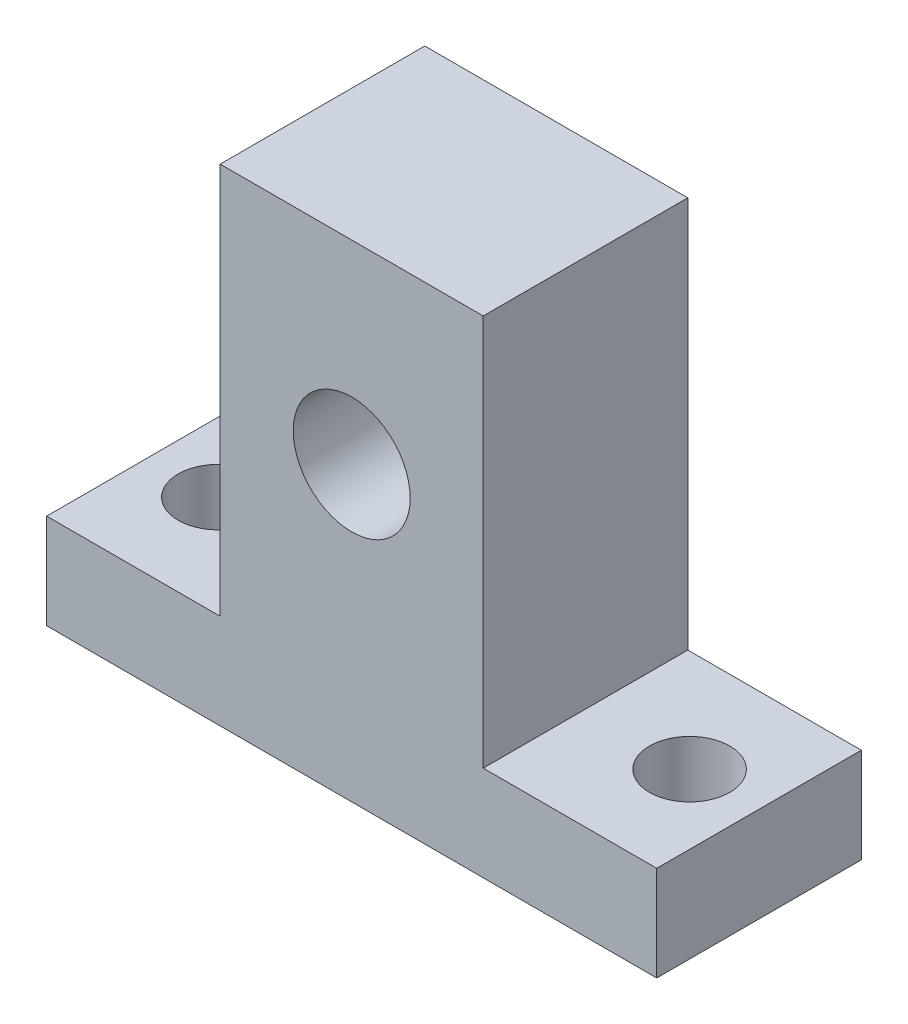
ISO-10303-21;
HEADER;
FILE_DESCRIPTION(('STEP AP214'),'2;1');
FILE_NAME('part.step','',(''),(''),'','','');
FILE_SCHEMA(('AUTOMOTIVE_DESIGN { 1 0 10303 214 1 1 1 1 }'));
ENDSEC;
DATA;
#1=APPLICATION_CONTEXT('core data for automotive mechanical design processes');
#2=APPLICATION_PROTOCOL_DEFINITION('international standard','automotive_design',2000,#1);
#3=PRODUCT_CONTEXT('',#1,'mechanical');
#4=PRODUCT('Part','Part','',(#3));
#5=PRODUCT_RELATED_PRODUCT_CATEGORY('part','',(#4));
#6=PRODUCT_DEFINITION_FORMATION('','',#4);
#7=PRODUCT_DEFINITION_CONTEXT('part definition',#1,'design');
#8=PRODUCT_DEFINITION('design','',#6,#7);
#9=PRODUCT_DEFINITION_SHAPE('','',#8);
#10=(LENGTH_UNIT() NAMED_UNIT(*) SI_UNIT(.MILLI.,.METRE.));
#11=(NAMED_UNIT(*) PLANE_ANGLE_UNIT() SI_UNIT($,.RADIAN.));
#12=(NAMED_UNIT(*) SI_UNIT($,.STERADIAN.) SOLID_ANGLE_UNIT());
#13=UNCERTAINTY_MEASURE_WITH_UNIT(LENGTH_MEASURE(1.E-05),#10,'distance_accuracy_value','');
#14=(GEOMETRIC_REPRESENTATION_CONTEXT(3) GLOBAL_UNCERTAINTY_ASSIGNED_CONTEXT((#13)) GLOBAL_UNIT_ASSIGNED_CONTEXT((#10,
#11,#12)) REPRESENTATION_CONTEXT('',''));
#15=CARTESIAN_POINT('',(0.,0.,0.));
#16=DIRECTION('',(0.,0.,1.));
#17=DIRECTION('',(1.,0.,0.));
#18=AXIS2_PLACEMENT_3D('',#15,#16,#17);
#19=CARTESIAN_POINT('',(0.,6.5,0.));
#20=DIRECTION('',(0.,-1.,0.));
#21=DIRECTION('',(0.,0.,-1.));
#22=AXIS2_PLACEMENT_3D('',#19,#20,#21);
#23=PLANE('',#22);
#24=CARTESIAN_POINT('',(4.75000000000001,6.5,-7.));
#25=DIRECTION('',(0.,1.,0.));
#26=DIRECTION('',(0.,0.,-1.));
#27=AXIS2_PLACEMENT_3D('',#24,#25,#26);
#28=CIRCLE('',#27,2.75);
#29=CARTESIAN_POINT('',(4.75000000000001,6.5,-4.25));
#30=VERTEX_POINT('',#29);
#31=EDGE_CURVE('E183',#30,#30,#28,.T.);
#32=ORIENTED_EDGE('',*,*,#31,.F.);
#33=EDGE_LOOP('',(#32));
#34=FACE_BOUND('',#33,.T.);
#35=DIRECTION('',(0.,0.,1.));
#36=VECTOR('',#35,1.);
#37=CARTESIAN_POINT('',(11.875,6.5,0.));
#38=LINE('',#37,#36);
#39=CARTESIAN_POINT('',(11.875,6.5,-14.));
#40=VERTEX_POINT('',#39);
#41=CARTESIAN_POINT('',(11.875,6.5,0.));
#42=VERTEX_POINT('',#41);
#43=EDGE_CURVE('E49',#40,#42,#38,.T.);
#44=ORIENTED_EDGE('',*,*,#43,.F.);
#45=DIRECTION('',(-1.,0.,0.));
#46=VECTOR('',#45,1.);
#47=CARTESIAN_POINT('',(0.,6.5,-14.));
#48=LINE('',#47,#46);
#49=CARTESIAN_POINT('',(0.,6.5,-14.));
#50=VERTEX_POINT('',#49);
#51=EDGE_CURVE('E138',#40,#50,#48,.T.);
#52=ORIENTED_EDGE('',*,*,#51,.T.);
#53=DIRECTION('',(0.,0.,1.));
#54=VECTOR('',#53,1.);
#55=CARTESIAN_POINT('',(0.,6.5,0.));
#56=LINE('',#55,#54);
#57=CARTESIAN_POINT('',(0.,6.5,0.));
#58=VERTEX_POINT('',#57);
#59=EDGE_CURVE('E129',#50,#58,#56,.T.);
#60=ORIENTED_EDGE('',*,*,#59,.T.);
#61=DIRECTION('',(1.,0.,0.));
#62=VECTOR('',#61,1.);
#63=CARTESIAN_POINT('',(0.,6.5,0.));
#64=LINE('',#63,#62);
#65=EDGE_CURVE('E134',#58,#42,#64,.T.);
#66=ORIENTED_EDGE('',*,*,#65,.T.);
#67=EDGE_LOOP('',(#44,#52,#60,#66));
#68=FACE_BOUND('',#67,.T.);
#69=ADVANCED_FACE('F34',(#34,#68),#23,.F.);
#70=CARTESIAN_POINT('',(37.,6.5,-7.));
#71=DIRECTION('',(0.,1.,0.));
#72=DIRECTION('',(0.,0.,1.));
#73=AXIS2_PLACEMENT_3D('',#70,#71,#72);
#74=CIRCLE('',#73,2.75);
#75=CARTESIAN_POINT('',(37.,6.5,-4.25));
#76=VERTEX_POINT('',#75);
#77=EDGE_CURVE('E189',#76,#76,#74,.T.);
#78=ORIENTED_EDGE('',*,*,#77,.F.);
#79=EDGE_LOOP('',(#78));
#80=FACE_BOUND('',#79,.T.);
#81=DIRECTION('',(0.,0.,-1.));
#82=VECTOR('',#81,1.);
#83=CARTESIAN_POINT('',(29.875,6.5,0.));
#84=LINE('',#83,#82);
#85=CARTESIAN_POINT('',(29.875,6.5,0.));
#86=VERTEX_POINT('',#85);
#87=CARTESIAN_POINT('',(29.875,6.5,-14.));
#88=VERTEX_POINT('',#87);
#89=EDGE_CURVE('E57',#86,#88,#84,.T.);
#90=ORIENTED_EDGE('',*,*,#89,.F.);
#91=CARTESIAN_POINT('',(41.75,6.5,0.));
#92=VERTEX_POINT('',#91);
#93=EDGE_CURVE('E132',#86,#92,#64,.T.);
#94=ORIENTED_EDGE('',*,*,#93,.T.);
#95=DIRECTION('',(0.,0.,-1.));
#96=VECTOR('',#95,1.);
#97=CARTESIAN_POINT('',(41.75,6.5,0.));
#98=LINE('',#97,#96);
#99=CARTESIAN_POINT('',(41.75,6.5,-14.));
#100=VERTEX_POINT('',#99);
#101=EDGE_CURVE('E136',#92,#100,#98,.T.);
#102=ORIENTED_EDGE('',*,*,#101,.T.);
#103=EDGE_CURVE('E139',#100,#88,#48,.T.);
#104=ORIENTED_EDGE('',*,*,#103,.T.);
#105=EDGE_LOOP('',(#90,#94,#102,#104));
#106=FACE_BOUND('',#105,.T.);
#107=ADVANCED_FACE('F204',(#80,#106),#23,.F.);
#108=CARTESIAN_POINT('',(0.,6.5,0.));
#109=DIRECTION('',(1.,0.,0.));
#110=DIRECTION('',(0.,0.,-1.));
#111=AXIS2_PLACEMENT_3D('',#108,#109,#110);
#112=PLANE('',#111);
#113=DIRECTION('',(0.,0.,1.));
#114=VECTOR('',#113,1.);
#115=CARTESIAN_POINT('',(0.,0.,0.));
#116=LINE('',#115,#114);
#117=CARTESIAN_POINT('',(0.,0.,-14.));
#118=VERTEX_POINT('',#117);
#119=CARTESIAN_POINT('',(0.,0.,0.));
#120=VERTEX_POINT('',#119);
#121=EDGE_CURVE('E120',#118,#120,#116,.T.);
#122=ORIENTED_EDGE('',*,*,#121,.T.);
#123=DIRECTION('',(0.,-1.,0.));
#124=VECTOR('',#123,1.);
#125=CARTESIAN_POINT('',(0.,6.5,0.));
#126=LINE('',#125,#124);
#127=EDGE_CURVE('E11',#58,#120,#126,.T.);
#128=ORIENTED_EDGE('',*,*,#127,.F.);
#129=ORIENTED_EDGE('',*,*,#59,.F.);
#130=DIRECTION('',(0.,-1.,0.));
#131=VECTOR('',#130,1.);
#132=CARTESIAN_POINT('',(0.,6.5,-14.));
#133=LINE('',#132,#131);
#134=EDGE_CURVE('E140',#50,#118,#133,.T.);
#135=ORIENTED_EDGE('',*,*,#134,.T.);
#136=EDGE_LOOP('',(#122,#128,#129,#135));
#137=FACE_BOUND('',#136,.T.);
#138=ADVANCED_FACE('F36',(#137),#112,.F.);
#139=CARTESIAN_POINT('',(0.,6.5,0.));
#140=DIRECTION('',(0.,0.,-1.));
#141=DIRECTION('',(-1.,0.,0.));
#142=AXIS2_PLACEMENT_3D('',#139,#140,#141);
#143=PLANE('',#142);
#144=CARTESIAN_POINT('',(20.875,20.,0.));
#145=DIRECTION('',(0.,0.,-1.));
#146=DIRECTION('',(-1.,0.,0.));
#147=AXIS2_PLACEMENT_3D('',#144,#145,#146);
#148=CIRCLE('',#147,4.);
#149=CARTESIAN_POINT('',(16.875,20.,0.));
#150=VERTEX_POINT('',#149);
#151=EDGE_CURVE('E174',#150,#150,#148,.T.);
#152=ORIENTED_EDGE('',*,*,#151,.T.);
#153=EDGE_LOOP('',(#152));
#154=FACE_BOUND('',#153,.T.);
#155=DIRECTION('',(1.,0.,0.));
#156=VECTOR('',#155,1.);
#157=CARTESIAN_POINT('',(0.,0.,0.));
#158=LINE('',#157,#156);
#159=CARTESIAN_POINT('',(41.75,0.,0.));
#160=VERTEX_POINT('',#159);
#161=EDGE_CURVE('E123',#120,#160,#158,.T.);
#162=ORIENTED_EDGE('',*,*,#161,.T.);
#163=DIRECTION('',(0.,-1.,0.));
#164=VECTOR('',#163,1.);
#165=CARTESIAN_POINT('',(41.75,6.5,0.));
#166=LINE('',#165,#164);
#167=EDGE_CURVE('E42',#92,#160,#166,.T.);
#168=ORIENTED_EDGE('',*,*,#167,.F.);
#169=ORIENTED_EDGE('',*,*,#93,.F.);
#170=DIRECTION('',(0.,-1.,0.));
#171=VECTOR('',#170,1.);
#172=CARTESIAN_POINT('',(29.875,33.3,0.));
#173=LINE('',#172,#171);
#174=CARTESIAN_POINT('',(29.875,33.3,0.));
#175=VERTEX_POINT('',#174);
#176=EDGE_CURVE('E105',#175,#86,#173,.T.);
#177=ORIENTED_EDGE('',*,*,#176,.F.);
#178=DIRECTION('',(1.,0.,0.));
#179=VECTOR('',#178,1.);
#180=CARTESIAN_POINT('',(11.875,33.3,0.));
#181=LINE('',#180,#179);
#182=CARTESIAN_POINT('',(11.875,33.3,0.));
#183=VERTEX_POINT('',#182);
#184=EDGE_CURVE('E99',#183,#175,#181,.T.);
#185=ORIENTED_EDGE('',*,*,#184,.F.);
#186=DIRECTION('',(0.,-1.,0.));
#187=VECTOR('',#186,1.);
#188=CARTESIAN_POINT('',(11.875,33.3,0.));
#189=LINE('',#188,#187);
#190=EDGE_CURVE('E103',#183,#42,#189,.T.);
#191=ORIENTED_EDGE('',*,*,#190,.T.);
#192=ORIENTED_EDGE('',*,*,#65,.F.);
#193=ORIENTED_EDGE('',*,*,#127,.T.);
#194=EDGE_LOOP('',(#162,#168,#169,#177,#185,#191,#192,#193));
#195=FACE_BOUND('',#194,.T.);
#196=ADVANCED_FACE('F101',(#154,#195),#143,.F.);
#197=CARTESIAN_POINT('',(41.75,6.5,0.));
#198=DIRECTION('',(-1.,0.,0.));
#199=DIRECTION('',(0.,0.,1.));
#200=AXIS2_PLACEMENT_3D('',#197,#198,#199);
#201=PLANE('',#200);
#202=DIRECTION('',(0.,0.,-1.));
#203=VECTOR('',#202,1.);
#204=CARTESIAN_POINT('',(41.75,0.,0.));
#205=LINE('',#204,#203);
#206=CARTESIAN_POINT('',(41.75,0.,-14.));
#207=VERTEX_POINT('',#206);
#208=EDGE_CURVE('E143',#160,#207,#205,.T.);
#209=ORIENTED_EDGE('',*,*,#208,.T.);
#210=DIRECTION('',(0.,-1.,0.));
#211=VECTOR('',#210,1.);
#212=CARTESIAN_POINT('',(41.75,6.5,-14.));
#213=LINE('',#212,#211);
#214=EDGE_CURVE('E148',#100,#207,#213,.T.);
#215=ORIENTED_EDGE('',*,*,#214,.F.);
#216=ORIENTED_EDGE('',*,*,#101,.F.);
#217=ORIENTED_EDGE('',*,*,#167,.T.);
#218=EDGE_LOOP('',(#209,#215,#216,#217));
#219=FACE_BOUND('',#218,.T.);
#220=ADVANCED_FACE('F155',(#219),#201,.F.);
#221=CARTESIAN_POINT('',(0.,6.5,-14.));
#222=DIRECTION('',(0.,0.,1.));
#223=DIRECTION('',(1.,0.,0.));
#224=AXIS2_PLACEMENT_3D('',#221,#222,#223);
#225=PLANE('',#224);
#226=CARTESIAN_POINT('',(20.875,20.,-14.));
#227=DIRECTION('',(0.,0.,1.));
#228=DIRECTION('',(1.,0.,0.));
#229=AXIS2_PLACEMENT_3D('',#226,#227,#228);
#230=CIRCLE('',#229,4.);
#231=CARTESIAN_POINT('',(24.875,20.,-14.));
#232=VERTEX_POINT('',#231);
#233=EDGE_CURVE('E179',#232,#232,#230,.T.);
#234=ORIENTED_EDGE('',*,*,#233,.T.);
#235=EDGE_LOOP('',(#234));
#236=FACE_BOUND('',#235,.T.);
#237=DIRECTION('',(-1.,0.,0.));
#238=VECTOR('',#237,1.);
#239=CARTESIAN_POINT('',(0.,0.,-14.));
#240=LINE('',#239,#238);
#241=EDGE_CURVE('E133',#207,#118,#240,.T.);
#242=ORIENTED_EDGE('',*,*,#241,.T.);
#243=ORIENTED_EDGE('',*,*,#134,.F.);
#244=ORIENTED_EDGE('',*,*,#51,.F.);
#245=DIRECTION('',(0.,-1.,0.));
#246=VECTOR('',#245,1.);
#247=CARTESIAN_POINT('',(11.875,33.3,-14.));
#248=LINE('',#247,#246);
#249=CARTESIAN_POINT('',(11.875,33.3,-14.));
#250=VERTEX_POINT('',#249);
#251=EDGE_CURVE('E168',#250,#40,#248,.T.);
#252=ORIENTED_EDGE('',*,*,#251,.F.);
#253=DIRECTION('',(-1.,0.,0.));
#254=VECTOR('',#253,1.);
#255=CARTESIAN_POINT('',(11.875,33.3,-14.));
#256=LINE('',#255,#254);
#257=CARTESIAN_POINT('',(29.875,33.3,-14.));
#258=VERTEX_POINT('',#257);
#259=EDGE_CURVE('E114',#258,#250,#256,.T.);
#260=ORIENTED_EDGE('',*,*,#259,.F.);
#261=DIRECTION('',(0.,-1.,0.));
#262=VECTOR('',#261,1.);
#263=CARTESIAN_POINT('',(29.875,33.3,-14.));
#264=LINE('',#263,#262);
#265=EDGE_CURVE('E125',#258,#88,#264,.T.);
#266=ORIENTED_EDGE('',*,*,#265,.T.);
#267=ORIENTED_EDGE('',*,*,#103,.F.);
#268=ORIENTED_EDGE('',*,*,#214,.T.);
#269=EDGE_LOOP('',(#242,#243,#244,#252,#260,#266,#267,#268));
#270=FACE_BOUND('',#269,.T.);
#271=ADVANCED_FACE('F163',(#236,#270),#225,.F.);
#272=CARTESIAN_POINT('',(0.,0.,0.));
#273=DIRECTION('',(0.,-1.,0.));
#274=DIRECTION('',(0.,0.,-1.));
#275=AXIS2_PLACEMENT_3D('',#272,#273,#274);
#276=PLANE('',#275);
#277=CARTESIAN_POINT('',(37.,0.,-7.));
#278=DIRECTION('',(0.,1.,0.));
#279=DIRECTION('',(0.,0.,1.));
#280=AXIS2_PLACEMENT_3D('',#277,#278,#279);
#281=CIRCLE('',#280,2.75);
#282=CARTESIAN_POINT('',(37.,0.,-4.25));
#283=VERTEX_POINT('',#282);
#284=EDGE_CURVE('E182',#283,#283,#281,.T.);
#285=ORIENTED_EDGE('',*,*,#284,.T.);
#286=EDGE_LOOP('',(#285));
#287=FACE_BOUND('',#286,.T.);
#288=CARTESIAN_POINT('',(4.75000000000001,0.,-7.));
#289=DIRECTION('',(0.,1.,0.));
#290=DIRECTION('',(0.,0.,-1.));
#291=AXIS2_PLACEMENT_3D('',#288,#289,#290);
#292=CIRCLE('',#291,2.75);
#293=CARTESIAN_POINT('',(4.75000000000001,0.,-4.25));
#294=VERTEX_POINT('',#293);
#295=EDGE_CURVE('E186',#294,#294,#292,.T.);
#296=ORIENTED_EDGE('',*,*,#295,.T.);
#297=EDGE_LOOP('',(#296));
#298=FACE_BOUND('',#297,.T.);
#299=ORIENTED_EDGE('',*,*,#121,.F.);
#300=ORIENTED_EDGE('',*,*,#241,.F.);
#301=ORIENTED_EDGE('',*,*,#208,.F.);
#302=ORIENTED_EDGE('',*,*,#161,.F.);
#303=EDGE_LOOP('',(#299,#300,#301,#302));
#304=FACE_BOUND('',#303,.T.);
#305=ADVANCED_FACE('F160',(#287,#298,#304),#276,.T.);
#306=CARTESIAN_POINT('',(11.875,33.3,0.));
#307=DIRECTION('',(1.,0.,0.));
#308=DIRECTION('',(0.,0.,-1.));
#309=AXIS2_PLACEMENT_3D('',#306,#307,#308);
#310=PLANE('',#309);
#311=ORIENTED_EDGE('',*,*,#43,.T.);
#312=ORIENTED_EDGE('',*,*,#190,.F.);
#313=DIRECTION('',(0.,0.,1.));
#314=VECTOR('',#313,1.);
#315=CARTESIAN_POINT('',(11.875,33.3,0.));
#316=LINE('',#315,#314);
#317=EDGE_CURVE('E109',#250,#183,#316,.T.);
#318=ORIENTED_EDGE('',*,*,#317,.F.);
#319=ORIENTED_EDGE('',*,*,#251,.T.);
#320=EDGE_LOOP('',(#311,#312,#318,#319));
#321=FACE_BOUND('',#320,.T.);
#322=ADVANCED_FACE('F119',(#321),#310,.F.);
#323=CARTESIAN_POINT('',(29.875,33.3,0.));
#324=DIRECTION('',(-1.,0.,0.));
#325=DIRECTION('',(0.,0.,1.));
#326=AXIS2_PLACEMENT_3D('',#323,#324,#325);
#327=PLANE('',#326);
#328=ORIENTED_EDGE('',*,*,#89,.T.);
#329=ORIENTED_EDGE('',*,*,#265,.F.);
#330=DIRECTION('',(0.,0.,-1.));
#331=VECTOR('',#330,1.);
#332=CARTESIAN_POINT('',(29.875,33.3,0.));
#333=LINE('',#332,#331);
#334=EDGE_CURVE('E108',#175,#258,#333,.T.);
#335=ORIENTED_EDGE('',*,*,#334,.F.);
#336=ORIENTED_EDGE('',*,*,#176,.T.);
#337=EDGE_LOOP('',(#328,#329,#335,#336));
#338=FACE_BOUND('',#337,.T.);
#339=ADVANCED_FACE('F237',(#338),#327,.F.);
#340=CARTESIAN_POINT('',(0.,33.3,0.));
#341=DIRECTION('',(0.,-1.,0.));
#342=DIRECTION('',(0.,0.,-1.));
#343=AXIS2_PLACEMENT_3D('',#340,#341,#342);
#344=PLANE('',#343);
#345=ORIENTED_EDGE('',*,*,#317,.T.);
#346=ORIENTED_EDGE('',*,*,#184,.T.);
#347=ORIENTED_EDGE('',*,*,#334,.T.);
#348=ORIENTED_EDGE('',*,*,#259,.T.);
#349=EDGE_LOOP('',(#345,#346,#347,#348));
#350=FACE_BOUND('',#349,.T.);
#351=ADVANCED_FACE('F112',(#350),#344,.F.);
#352=CARTESIAN_POINT('',(20.875,20.,-14.));
#353=DIRECTION('',(0.,0.,1.));
#354=DIRECTION('',(1.,0.,0.));
#355=AXIS2_PLACEMENT_3D('',#352,#353,#354);
#356=CYLINDRICAL_SURFACE('',#355,4.);
#357=ORIENTED_EDGE('',*,*,#233,.F.);
#358=EDGE_LOOP('',(#357));
#359=FACE_BOUND('',#358,.T.);
#360=ORIENTED_EDGE('',*,*,#151,.F.);
#361=EDGE_LOOP('',(#360));
#362=FACE_BOUND('',#361,.T.);
#363=ADVANCED_FACE('F227',(#359,#362),#356,.F.);
#364=CARTESIAN_POINT('',(4.75000000000001,0.,-7.));
#365=DIRECTION('',(0.,1.,0.));
#366=DIRECTION('',(0.,0.,1.));
#367=AXIS2_PLACEMENT_3D('',#364,#365,#366);
#368=CYLINDRICAL_SURFACE('',#367,2.75);
#369=CARTESIAN_POINT('',(4.75000000000001,0.,-4.25));
#370=CARTESIAN_POINT('',(4.75000000000001,0.0677083333333332,-4.25));
#371=CARTESIAN_POINT('',(4.75000000000001,0.135416666666667,-4.25));
#372=CARTESIAN_POINT('',(4.75000000000001,0.270833333333333,-4.25));
#373=CARTESIAN_POINT('',(4.75000000000001,0.338541666666667,-4.25));
#374=CARTESIAN_POINT('',(4.75000000000001,0.473958333333333,-4.25));
#375=CARTESIAN_POINT('',(4.75000000000001,0.541666666666667,-4.25));
#376=CARTESIAN_POINT('',(4.75000000000001,0.677083333333333,-4.25));
#377=CARTESIAN_POINT('',(4.75000000000001,0.744791666666667,-4.25));
#378=CARTESIAN_POINT('',(4.75000000000001,0.880208333333333,-4.25));
#379=CARTESIAN_POINT('',(4.75000000000001,0.947916666666667,-4.25));
#380=CARTESIAN_POINT('',(4.75000000000001,1.08333333333333,-4.25));
#381=CARTESIAN_POINT('',(4.75000000000001,1.15104166666667,-4.25));
#382=CARTESIAN_POINT('',(4.75000000000001,1.28645833333333,-4.25));
#383=CARTESIAN_POINT('',(4.75000000000001,1.35416666666667,-4.25));
#384=CARTESIAN_POINT('',(4.75000000000001,1.48958333333333,-4.25));
#385=CARTESIAN_POINT('',(4.75000000000001,1.55729166666667,-4.25));
#386=CARTESIAN_POINT('',(4.75000000000001,1.69270833333333,-4.25));
#387=CARTESIAN_POINT('',(4.75000000000001,1.76041666666667,-4.25));
#388=CARTESIAN_POINT('',(4.75000000000001,1.89583333333333,-4.25));
#389=CARTESIAN_POINT('',(4.75000000000001,1.96354166666667,-4.25));
#390=CARTESIAN_POINT('',(4.75000000000001,2.09895833333333,-4.25));
#391=CARTESIAN_POINT('',(4.75000000000001,2.16666666666667,-4.25));
#392=CARTESIAN_POINT('',(4.75000000000001,2.30208333333333,-4.25));
#393=CARTESIAN_POINT('',(4.75000000000001,2.36979166666667,-4.25));
#394=CARTESIAN_POINT('',(4.75000000000001,2.50520833333333,-4.25));
#395=CARTESIAN_POINT('',(4.75000000000001,2.57291666666667,-4.25));
#396=CARTESIAN_POINT('',(4.75000000000001,2.70833333333333,-4.25));
#397=CARTESIAN_POINT('',(4.75000000000001,2.77604166666667,-4.25));
#398=CARTESIAN_POINT('',(4.75000000000001,2.91145833333333,-4.25));
#399=CARTESIAN_POINT('',(4.75000000000001,2.97916666666667,-4.25));
#400=CARTESIAN_POINT('',(4.75000000000001,3.11458333333333,-4.25));
#401=CARTESIAN_POINT('',(4.75000000000001,3.18229166666667,-4.25));
#402=CARTESIAN_POINT('',(4.75000000000001,3.31770833333333,-4.25));
#403=CARTESIAN_POINT('',(4.75000000000001,3.38541666666667,-4.25));
#404=CARTESIAN_POINT('',(4.75000000000001,3.52083333333333,-4.25));
#405=CARTESIAN_POINT('',(4.75000000000001,3.58854166666667,-4.25));
#406=CARTESIAN_POINT('',(4.75000000000001,3.72395833333333,-4.25));
#407=CARTESIAN_POINT('',(4.75000000000001,3.79166666666667,-4.25));
#408=CARTESIAN_POINT('',(4.75000000000001,3.92708333333333,-4.25));
#409=CARTESIAN_POINT('',(4.75000000000001,3.99479166666667,-4.25));
#410=CARTESIAN_POINT('',(4.75000000000001,4.13020833333333,-4.25));
#411=CARTESIAN_POINT('',(4.75000000000001,4.19791666666667,-4.25));
#412=CARTESIAN_POINT('',(4.75000000000001,4.33333333333333,-4.25));
#413=CARTESIAN_POINT('',(4.75000000000001,4.40104166666667,-4.25));
#414=CARTESIAN_POINT('',(4.75000000000001,4.53645833333333,-4.25));
#415=CARTESIAN_POINT('',(4.75000000000001,4.60416666666667,-4.25));
#416=CARTESIAN_POINT('',(4.75000000000001,4.73958333333333,-4.25));
#417=CARTESIAN_POINT('',(4.75000000000001,4.80729166666667,-4.25));
#418=CARTESIAN_POINT('',(4.75000000000001,4.94270833333333,-4.25));
#419=CARTESIAN_POINT('',(4.75000000000001,5.01041666666667,-4.25));
#420=CARTESIAN_POINT('',(4.75000000000001,5.14583333333333,-4.25));
#421=CARTESIAN_POINT('',(4.75000000000001,5.21354166666667,-4.25));
#422=CARTESIAN_POINT('',(4.75000000000001,5.34895833333333,-4.25));
#423=CARTESIAN_POINT('',(4.75000000000001,5.41666666666667,-4.25));
#424=CARTESIAN_POINT('',(4.75000000000001,5.55208333333333,-4.25));
#425=CARTESIAN_POINT('',(4.75000000000001,5.61979166666667,-4.25));
#426=CARTESIAN_POINT('',(4.75000000000001,5.75520833333333,-4.25));
#427=CARTESIAN_POINT('',(4.75000000000001,5.82291666666667,-4.25));
#428=CARTESIAN_POINT('',(4.75000000000001,5.95833333333333,-4.25));
#429=CARTESIAN_POINT('',(4.75000000000001,6.02604166666667,-4.25));
#430=CARTESIAN_POINT('',(4.75000000000001,6.16145833333333,-4.25));
#431=CARTESIAN_POINT('',(4.75000000000001,6.22916666666667,-4.25));
#432=CARTESIAN_POINT('',(4.75000000000001,6.36458333333333,-4.25));
#433=CARTESIAN_POINT('',(4.75000000000001,6.43229166666667,-4.25));
#434=CARTESIAN_POINT('',(4.75000000000001,6.5,-4.25));
#435=B_SPLINE_CURVE_WITH_KNOTS('',3,(#369,#370,#371,#372,#373,#374,#375,#376,#377,#378,#379,
#380,#381,#382,#383,#384,#385,#386,#387,#388,#389,#390,#391,#392,#393,#394,#395,#396,#397,#398,
#399,#400,#401,#402,#403,#404,#405,#406,#407,#408,#409,#410,#411,#412,#413,#414,#415,#416,#417,
#418,#419,#420,#421,#422,#423,#424,#425,#426,#427,#428,#429,#430,#431,#432,#433,#434),
.UNSPECIFIED.,.F.,.F.,(4,2,2,2,2,2,2,2,2,2,2,2,2,2,2,2,2,2,2,2,2,2,2,2,2,2,2,2,2,2,2,2,4),(0.,
0.203125,0.40625,0.609375,0.8125,1.015625,1.21875,1.421875,1.625,1.828125,2.03125,2.234375,
2.4375,2.640625,2.84375,3.046875,3.25,3.453125,3.65625,3.859375,4.0625,4.265625,4.46875,
4.671875,4.875,5.078125,5.28125,5.484375,5.6875,5.890625,6.09375,6.296875,6.5),.UNSPECIFIED.);
#436=EDGE_CURVE('BSEAM200',#294,#30,#435,.T.);
#437=ORIENTED_EDGE('',*,*,#295,.F.);
#438=ORIENTED_EDGE('',*,*,#31,.T.);
#439=ORIENTED_EDGE('',*,*,#436,.T.);
#440=ORIENTED_EDGE('',*,*,#436,.F.);
#441=EDGE_LOOP('',(#437,#439,#438,#440));
#442=FACE_BOUND('',#441,.T.);
#443=ADVANCED_FACE('F200',(#442),#368,.F.);
#444=CARTESIAN_POINT('',(37.,0.,-7.));
#445=DIRECTION('',(0.,1.,0.));
#446=DIRECTION('',(0.,0.,1.));
#447=AXIS2_PLACEMENT_3D('',#444,#445,#446);
#448=CYLINDRICAL_SURFACE('',#447,2.75);
#449=CARTESIAN_POINT('',(37.,0.,-4.25));
#450=CARTESIAN_POINT('',(37.,0.0677083333333332,-4.25));
#451=CARTESIAN_POINT('',(37.,0.135416666666667,-4.25));
#452=CARTESIAN_POINT('',(37.,0.270833333333333,-4.25));
#453=CARTESIAN_POINT('',(37.,0.338541666666667,-4.25));
#454=CARTESIAN_POINT('',(37.,0.473958333333333,-4.25));
#455=CARTESIAN_POINT('',(37.,0.541666666666667,-4.25));
#456=CARTESIAN_POINT('',(37.,0.677083333333333,-4.25));
#457=CARTESIAN_POINT('',(37.,0.744791666666667,-4.25));
#458=CARTESIAN_POINT('',(37.,0.880208333333333,-4.25));
#459=CARTESIAN_POINT('',(37.,0.947916666666667,-4.25));
#460=CARTESIAN_POINT('',(37.,1.08333333333333,-4.25));
#461=CARTESIAN_POINT('',(37.,1.15104166666667,-4.25));
#462=CARTESIAN_POINT('',(37.,1.28645833333333,-4.25));
#463=CARTESIAN_POINT('',(37.,1.35416666666667,-4.25));
#464=CARTESIAN_POINT('',(37.,1.48958333333333,-4.25));
#465=CARTESIAN_POINT('',(37.,1.55729166666667,-4.25));
#466=CARTESIAN_POINT('',(37.,1.69270833333333,-4.25));
#467=CARTESIAN_POINT('',(37.,1.76041666666667,-4.25));
#468=CARTESIAN_POINT('',(37.,1.89583333333333,-4.25));
#469=CARTESIAN_POINT('',(37.,1.96354166666667,-4.25));
#470=CARTESIAN_POINT('',(37.,2.09895833333333,-4.25));
#471=CARTESIAN_POINT('',(37.,2.16666666666667,-4.25));
#472=CARTESIAN_POINT('',(37.,2.30208333333333,-4.25));
#473=CARTESIAN_POINT('',(37.,2.36979166666667,-4.25));
#474=CARTESIAN_POINT('',(37.,2.50520833333333,-4.25));
#475=CARTESIAN_POINT('',(37.,2.57291666666667,-4.25));
#476=CARTESIAN_POINT('',(37.,2.70833333333333,-4.25));
#477=CARTESIAN_POINT('',(37.,2.77604166666667,-4.25));
#478=CARTESIAN_POINT('',(37.,2.91145833333333,-4.25));
#479=CARTESIAN_POINT('',(37.,2.97916666666667,-4.25));
#480=CARTESIAN_POINT('',(37.,3.11458333333333,-4.25));
#481=CARTESIAN_POINT('',(37.,3.18229166666667,-4.25));
#482=CARTESIAN_POINT('',(37.,3.31770833333333,-4.25));
#483=CARTESIAN_POINT('',(37.,3.38541666666667,-4.25));
#484=CARTESIAN_POINT('',(37.,3.52083333333333,-4.25));
#485=CARTESIAN_POINT('',(37.,3.58854166666667,-4.25));
#486=CARTESIAN_POINT('',(37.,3.72395833333333,-4.25));
#487=CARTESIAN_POINT('',(37.,3.79166666666667,-4.25));
#488=CARTESIAN_POINT('',(37.,3.92708333333333,-4.25));
#489=CARTESIAN_POINT('',(37.,3.99479166666667,-4.25));
#490=CARTESIAN_POINT('',(37.,4.13020833333333,-4.25));
#491=CARTESIAN_POINT('',(37.,4.19791666666667,-4.25));
#492=CARTESIAN_POINT('',(37.,4.33333333333333,-4.25));
#493=CARTESIAN_POINT('',(37.,4.40104166666667,-4.25));
#494=CARTESIAN_POINT('',(37.,4.53645833333333,-4.25));
#495=CARTESIAN_POINT('',(37.,4.60416666666667,-4.25));
#496=CARTESIAN_POINT('',(37.,4.73958333333333,-4.25));
#497=CARTESIAN_POINT('',(37.,4.80729166666667,-4.25));
#498=CARTESIAN_POINT('',(37.,4.94270833333333,-4.25));
#499=CARTESIAN_POINT('',(37.,5.01041666666667,-4.25));
#500=CARTESIAN_POINT('',(37.,5.14583333333333,-4.25));
#501=CARTESIAN_POINT('',(37.,5.21354166666667,-4.25));
#502=CARTESIAN_POINT('',(37.,5.34895833333333,-4.25));
#503=CARTESIAN_POINT('',(37.,5.41666666666667,-4.25));
#504=CARTESIAN_POINT('',(37.,5.55208333333333,-4.25));
#505=CARTESIAN_POINT('',(37.,5.61979166666667,-4.25));
#506=CARTESIAN_POINT('',(37.,5.75520833333333,-4.25));
#507=CARTESIAN_POINT('',(37.,5.82291666666667,-4.25));
#508=CARTESIAN_POINT('',(37.,5.95833333333333,-4.25));
#509=CARTESIAN_POINT('',(37.,6.02604166666667,-4.25));
#510=CARTESIAN_POINT('',(37.,6.16145833333333,-4.25));
#511=CARTESIAN_POINT('',(37.,6.22916666666667,-4.25));
#512=CARTESIAN_POINT('',(37.,6.36458333333333,-4.25));
#513=CARTESIAN_POINT('',(37.,6.43229166666667,-4.25));
#514=CARTESIAN_POINT('',(37.,6.5,-4.25));
#515=B_SPLINE_CURVE_WITH_KNOTS('',3,(#449,#450,#451,#452,#453,#454,#455,#456,#457,#458,#459,
#460,#461,#462,#463,#464,#465,#466,#467,#468,#469,#470,#471,#472,#473,#474,#475,#476,#477,#478,
#479,#480,#481,#482,#483,#484,#485,#486,#487,#488,#489,#490,#491,#492,#493,#494,#495,#496,#497,
#498,#499,#500,#501,#502,#503,#504,#505,#506,#507,#508,#509,#510,#511,#512,#513,#514),
.UNSPECIFIED.,.F.,.F.,(4,2,2,2,2,2,2,2,2,2,2,2,2,2,2,2,2,2,2,2,2,2,2,2,2,2,2,2,2,2,2,2,4),(0.,
0.203125,0.40625,0.609375,0.8125,1.015625,1.21875,1.421875,1.625,1.828125,2.03125,2.234375,
2.4375,2.640625,2.84375,3.046875,3.25,3.453125,3.65625,3.859375,4.0625,4.265625,4.46875,
4.671875,4.875,5.078125,5.28125,5.484375,5.6875,5.890625,6.09375,6.296875,6.5),.UNSPECIFIED.);
#516=EDGE_CURVE('BSEAM197',#283,#76,#515,.T.);
#517=ORIENTED_EDGE('',*,*,#284,.F.);
#518=ORIENTED_EDGE('',*,*,#77,.T.);
#519=ORIENTED_EDGE('',*,*,#516,.T.);
#520=ORIENTED_EDGE('',*,*,#516,.F.);
#521=EDGE_LOOP('',(#517,#519,#518,#520));
#522=FACE_BOUND('',#521,.T.);
#523=ADVANCED_FACE('F197',(#522),#448,.F.);
#524=CLOSED_SHELL('',(#69,#107,#138,#196,#220,#271,#305,#322,#339,#351,#363,#443,#523));
#525=MANIFOLD_SOLID_BREP('B2',#524);
#526=ADVANCED_BREP_SHAPE_REPRESENTATION('',(#18,#525),#14);
#527=SHAPE_DEFINITION_REPRESENTATION(#9,#526);
ENDSEC;
END-ISO-10303-21;
